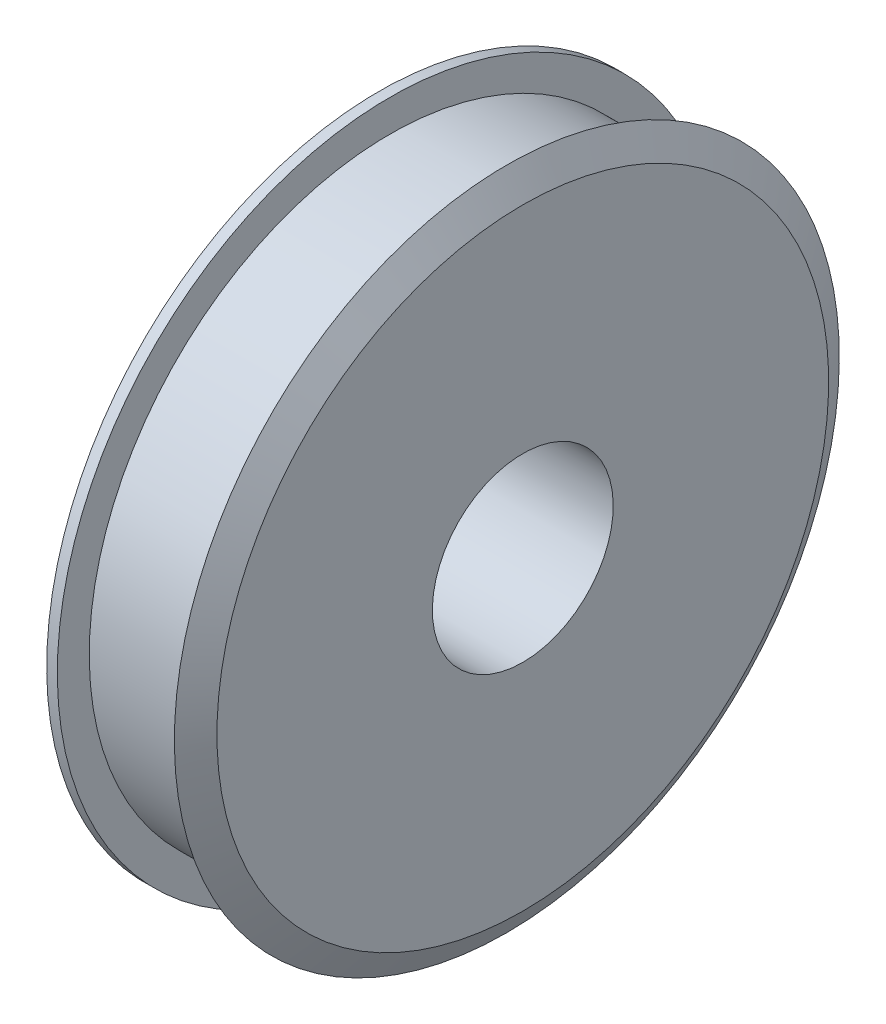
ISO-10303-21;
HEADER;
FILE_DESCRIPTION(('STEP AP214'),'2;1');
FILE_NAME('part.step','',(''),(''),'','','');
FILE_SCHEMA(('AUTOMOTIVE_DESIGN { 1 0 10303 214 1 1 1 1 }'));
ENDSEC;
DATA;
#1=APPLICATION_CONTEXT('core data for automotive mechanical design processes');
#2=APPLICATION_PROTOCOL_DEFINITION('international standard','automotive_design',2000,#1);
#3=PRODUCT_CONTEXT('',#1,'mechanical');
#4=PRODUCT('Part','Part','',(#3));
#5=PRODUCT_RELATED_PRODUCT_CATEGORY('part','',(#4));
#6=PRODUCT_DEFINITION_FORMATION('','',#4);
#7=PRODUCT_DEFINITION_CONTEXT('part definition',#1,'design');
#8=PRODUCT_DEFINITION('design','',#6,#7);
#9=PRODUCT_DEFINITION_SHAPE('','',#8);
#10=(LENGTH_UNIT() NAMED_UNIT(*) SI_UNIT(.MILLI.,.METRE.));
#11=(NAMED_UNIT(*) PLANE_ANGLE_UNIT() SI_UNIT($,.RADIAN.));
#12=(NAMED_UNIT(*) SI_UNIT($,.STERADIAN.) SOLID_ANGLE_UNIT());
#13=UNCERTAINTY_MEASURE_WITH_UNIT(LENGTH_MEASURE(1.E-05),#10,'distance_accuracy_value','');
#14=(GEOMETRIC_REPRESENTATION_CONTEXT(3) GLOBAL_UNCERTAINTY_ASSIGNED_CONTEXT((#13)) GLOBAL_UNIT_ASSIGNED_CONTEXT((#10,
#11,#12)) REPRESENTATION_CONTEXT('',''));
#15=CARTESIAN_POINT('',(0.,0.,0.));
#16=DIRECTION('',(0.,0.,1.));
#17=DIRECTION('',(1.,0.,0.));
#18=AXIS2_PLACEMENT_3D('',#15,#16,#17);
#19=CARTESIAN_POINT('',(-24.,0.,0.));
#20=DIRECTION('',(1.,0.,0.));
#21=DIRECTION('',(0.,1.,0.));
#22=AXIS2_PLACEMENT_3D('',#19,#20,#21);
#23=PLANE('',#22);
#24=CARTESIAN_POINT('',(-24.,0.,0.));
#25=DIRECTION('',(-1.,0.,0.));
#26=DIRECTION('',(0.,-1.,0.));
#27=AXIS2_PLACEMENT_3D('',#24,#25,#26);
#28=CIRCLE('',#27,17.);
#29=CARTESIAN_POINT('',(-24.,-17.,0.));
#30=VERTEX_POINT('',#29);
#31=EDGE_CURVE('E62',#30,#30,#28,.T.);
#32=ORIENTED_EDGE('',*,*,#31,.F.);
#33=EDGE_LOOP('',(#32));
#34=FACE_BOUND('',#33,.T.);
#35=CARTESIAN_POINT('',(-24.,0.,0.));
#36=DIRECTION('',(-1.,0.,0.));
#37=DIRECTION('',(0.,-1.,0.));
#38=AXIS2_PLACEMENT_3D('',#35,#36,#37);
#39=CIRCLE('',#38,62.5);
#40=CARTESIAN_POINT('',(-24.,-62.5,0.));
#41=VERTEX_POINT('',#40);
#42=EDGE_CURVE('E51',#41,#41,#39,.T.);
#43=ORIENTED_EDGE('',*,*,#42,.T.);
#44=EDGE_LOOP('',(#43));
#45=FACE_BOUND('',#44,.T.);
#46=ADVANCED_FACE('F38',(#34,#45),#23,.F.);
#47=CARTESIAN_POINT('',(-24.,0.,0.));
#48=DIRECTION('',(-1.,0.,0.));
#49=DIRECTION('',(0.,-1.,0.));
#50=AXIS2_PLACEMENT_3D('',#47,#48,#49);
#51=CYLINDRICAL_SURFACE('',#50,62.5);
#52=ORIENTED_EDGE('',*,*,#42,.F.);
#53=EDGE_LOOP('',(#52));
#54=FACE_BOUND('',#53,.T.);
#55=CARTESIAN_POINT('',(-22.,0.,0.));
#56=DIRECTION('',(-1.,0.,0.));
#57=DIRECTION('',(0.,-1.,0.));
#58=AXIS2_PLACEMENT_3D('',#55,#56,#57);
#59=CIRCLE('',#58,62.5);
#60=CARTESIAN_POINT('',(-22.,-62.5,0.));
#61=VERTEX_POINT('',#60);
#62=EDGE_CURVE('E46',#61,#61,#59,.T.);
#63=ORIENTED_EDGE('',*,*,#62,.T.);
#64=EDGE_LOOP('',(#63));
#65=FACE_BOUND('',#64,.T.);
#66=ADVANCED_FACE('F74',(#54,#65),#51,.T.);
#67=CARTESIAN_POINT('',(-22.,0.,0.));
#68=DIRECTION('',(-1.,0.,0.));
#69=DIRECTION('',(0.,-1.,0.));
#70=AXIS2_PLACEMENT_3D('',#67,#68,#69);
#71=PLANE('',#70);
#72=ORIENTED_EDGE('',*,*,#62,.F.);
#73=EDGE_LOOP('',(#72));
#74=FACE_BOUND('',#73,.T.);
#75=CARTESIAN_POINT('',(-22.,0.,0.));
#76=DIRECTION('',(-1.,0.,0.));
#77=DIRECTION('',(0.,-1.,0.));
#78=AXIS2_PLACEMENT_3D('',#75,#76,#77);
#79=CIRCLE('',#78,56.5);
#80=CARTESIAN_POINT('',(-22.,-56.5,0.));
#81=VERTEX_POINT('',#80);
#82=EDGE_CURVE('E10',#81,#81,#79,.T.);
#83=ORIENTED_EDGE('',*,*,#82,.T.);
#84=EDGE_LOOP('',(#83));
#85=FACE_BOUND('',#84,.T.);
#86=ADVANCED_FACE('F77',(#74,#85),#71,.F.);
#87=CARTESIAN_POINT('',(-24.,0.,0.));
#88=DIRECTION('',(-1.,0.,0.));
#89=DIRECTION('',(0.,-1.,0.));
#90=AXIS2_PLACEMENT_3D('',#87,#88,#89);
#91=CYLINDRICAL_SURFACE('',#90,56.5);
#92=ORIENTED_EDGE('',*,*,#82,.F.);
#93=EDGE_LOOP('',(#92));
#94=FACE_BOUND('',#93,.T.);
#95=CARTESIAN_POINT('',(0.,0.,0.));
#96=DIRECTION('',(-1.,0.,0.));
#97=DIRECTION('',(0.,-1.,0.));
#98=AXIS2_PLACEMENT_3D('',#95,#96,#97);
#99=CIRCLE('',#98,56.5);
#100=CARTESIAN_POINT('',(0.,-56.5,0.));
#101=VERTEX_POINT('',#100);
#102=EDGE_CURVE('E60',#101,#101,#99,.T.);
#103=ORIENTED_EDGE('',*,*,#102,.T.);
#104=EDGE_LOOP('',(#103));
#105=FACE_BOUND('',#104,.T.);
#106=ADVANCED_FACE('F82',(#94,#105),#91,.T.);
#107=CARTESIAN_POINT('',(3.,57.5,0.));
#108=DIRECTION('',(1.,0.,0.));
#109=DIRECTION('',(0.,1.,0.));
#110=AXIS2_PLACEMENT_3D('',#107,#108,#109);
#111=PLANE('',#110);
#112=CARTESIAN_POINT('',(3.,0.,0.));
#113=DIRECTION('',(-1.,0.,0.));
#114=DIRECTION('',(0.,-1.,0.));
#115=AXIS2_PLACEMENT_3D('',#112,#113,#114);
#116=CIRCLE('',#115,17.);
#117=CARTESIAN_POINT('',(3.,-17.,0.));
#118=VERTEX_POINT('',#117);
#119=EDGE_CURVE('E56',#118,#118,#116,.T.);
#120=ORIENTED_EDGE('',*,*,#119,.T.);
#121=EDGE_LOOP('',(#120));
#122=FACE_BOUND('',#121,.T.);
#123=CARTESIAN_POINT('',(3.,0.,0.));
#124=DIRECTION('',(-1.,0.,0.));
#125=DIRECTION('',(0.,-1.,0.));
#126=AXIS2_PLACEMENT_3D('',#123,#124,#125);
#127=CIRCLE('',#126,57.5);
#128=CARTESIAN_POINT('',(3.,-57.5,0.));
#129=VERTEX_POINT('',#128);
#130=EDGE_CURVE('E54',#129,#129,#127,.T.);
#131=ORIENTED_EDGE('',*,*,#130,.F.);
#132=EDGE_LOOP('',(#131));
#133=FACE_BOUND('',#132,.T.);
#134=ADVANCED_FACE('F87',(#122,#133),#111,.T.);
#135=CARTESIAN_POINT('',(0.,0.,0.));
#136=DIRECTION('',(-1.,0.,0.));
#137=DIRECTION('',(0.,-1.,0.));
#138=AXIS2_PLACEMENT_3D('',#135,#136,#137);
#139=CONICAL_SURFACE('',#138,62.5,1.03037682652431);
#140=ORIENTED_EDGE('',*,*,#130,.T.);
#141=EDGE_LOOP('',(#140));
#142=FACE_BOUND('',#141,.T.);
#143=CARTESIAN_POINT('',(0.,0.,0.));
#144=DIRECTION('',(-1.,0.,0.));
#145=DIRECTION('',(0.,-1.,0.));
#146=AXIS2_PLACEMENT_3D('',#143,#144,#145);
#147=CIRCLE('',#146,62.5);
#148=CARTESIAN_POINT('',(0.,-62.5,0.));
#149=VERTEX_POINT('',#148);
#150=EDGE_CURVE('E42',#149,#149,#147,.T.);
#151=ORIENTED_EDGE('',*,*,#150,.F.);
#152=EDGE_LOOP('',(#151));
#153=FACE_BOUND('',#152,.T.);
#154=ADVANCED_FACE('F105',(#142,#153),#139,.T.);
#155=CARTESIAN_POINT('',(0.,0.,0.));
#156=DIRECTION('',(-1.,0.,0.));
#157=DIRECTION('',(0.,-1.,0.));
#158=AXIS2_PLACEMENT_3D('',#155,#156,#157);
#159=PLANE('',#158);
#160=ORIENTED_EDGE('',*,*,#102,.F.);
#161=EDGE_LOOP('',(#160));
#162=FACE_BOUND('',#161,.T.);
#163=ORIENTED_EDGE('',*,*,#150,.T.);
#164=EDGE_LOOP('',(#163));
#165=FACE_BOUND('',#164,.T.);
#166=ADVANCED_FACE('F40',(#162,#165),#159,.T.);
#167=CARTESIAN_POINT('',(3.,0.,0.));
#168=DIRECTION('',(-1.,0.,0.));
#169=DIRECTION('',(0.,-1.,0.));
#170=AXIS2_PLACEMENT_3D('',#167,#168,#169);
#171=CYLINDRICAL_SURFACE('',#170,17.);
#172=ORIENTED_EDGE('',*,*,#119,.F.);
#173=EDGE_LOOP('',(#172));
#174=FACE_BOUND('',#173,.T.);
#175=ORIENTED_EDGE('',*,*,#31,.T.);
#176=EDGE_LOOP('',(#175));
#177=FACE_BOUND('',#176,.T.);
#178=ADVANCED_FACE('F99',(#174,#177),#171,.F.);
#179=CLOSED_SHELL('',(#46,#66,#86,#106,#134,#154,#166,#178));
#180=MANIFOLD_SOLID_BREP('B2',#179);
#181=ADVANCED_BREP_SHAPE_REPRESENTATION('',(#18,#180),#14);
#182=SHAPE_DEFINITION_REPRESENTATION(#9,#181);
ENDSEC;
END-ISO-10303-21;
